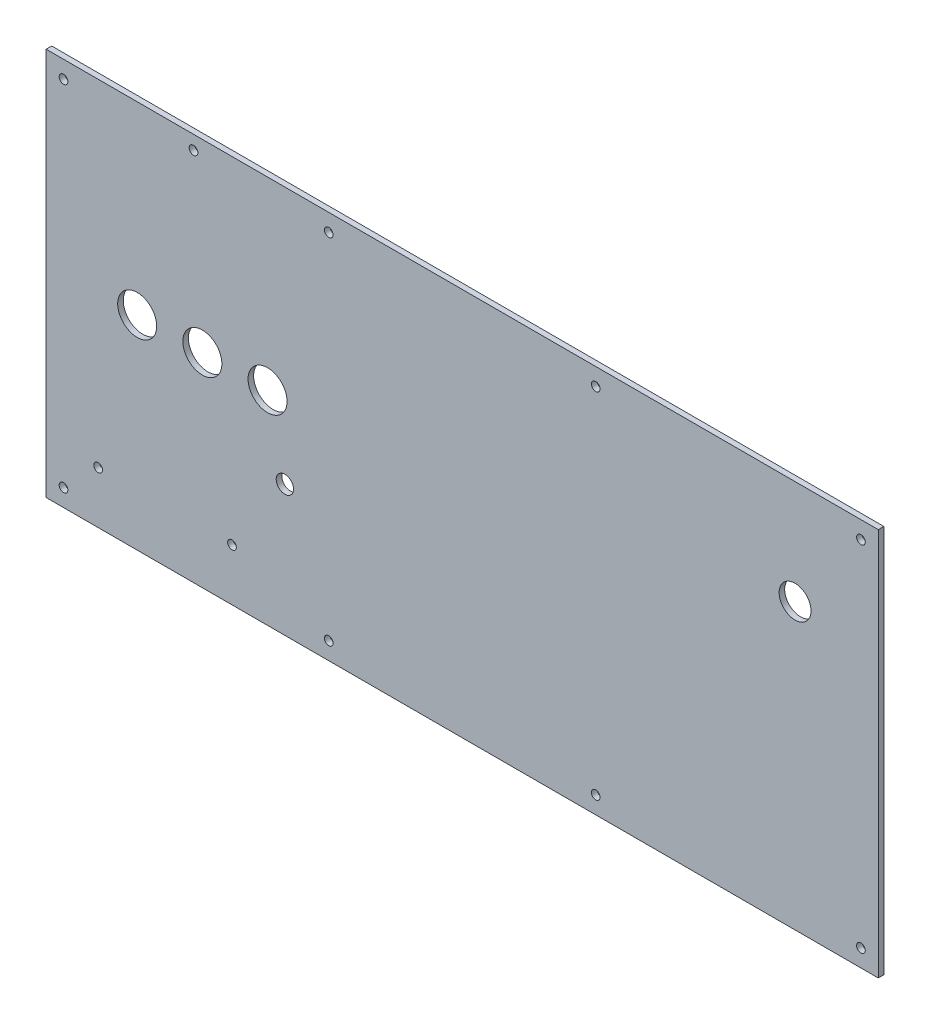
ISO-10303-21;
HEADER;
FILE_DESCRIPTION(('STEP AP214'),'2;1');
FILE_NAME('part.step','',(''),(''),'','','');
FILE_SCHEMA(('AUTOMOTIVE_DESIGN { 1 0 10303 214 1 1 1 1 }'));
ENDSEC;
DATA;
#1=APPLICATION_CONTEXT('core data for automotive mechanical design processes');
#2=APPLICATION_PROTOCOL_DEFINITION('international standard','automotive_design',2000,#1);
#3=PRODUCT_CONTEXT('',#1,'mechanical');
#4=PRODUCT('Part','Part','',(#3));
#5=PRODUCT_RELATED_PRODUCT_CATEGORY('part','',(#4));
#6=PRODUCT_DEFINITION_FORMATION('','',#4);
#7=PRODUCT_DEFINITION_CONTEXT('part definition',#1,'design');
#8=PRODUCT_DEFINITION('design','',#6,#7);
#9=PRODUCT_DEFINITION_SHAPE('','',#8);
#10=(LENGTH_UNIT() NAMED_UNIT(*) SI_UNIT(.MILLI.,.METRE.));
#11=(NAMED_UNIT(*) PLANE_ANGLE_UNIT() SI_UNIT($,.RADIAN.));
#12=(NAMED_UNIT(*) SI_UNIT($,.STERADIAN.) SOLID_ANGLE_UNIT());
#13=UNCERTAINTY_MEASURE_WITH_UNIT(LENGTH_MEASURE(1.E-05),#10,'distance_accuracy_value','');
#14=(GEOMETRIC_REPRESENTATION_CONTEXT(3) GLOBAL_UNCERTAINTY_ASSIGNED_CONTEXT((#13)) GLOBAL_UNIT_ASSIGNED_CONTEXT((#10,
#11,#12)) REPRESENTATION_CONTEXT('',''));
#15=CARTESIAN_POINT('',(0.,0.,0.));
#16=DIRECTION('',(0.,0.,1.));
#17=DIRECTION('',(1.,0.,0.));
#18=AXIS2_PLACEMENT_3D('',#15,#16,#17);
#19=CARTESIAN_POINT('',(-97.155,142.24,2.032));
#20=DIRECTION('',(1.,0.,0.));
#21=DIRECTION('',(0.,1.,0.));
#22=AXIS2_PLACEMENT_3D('',#19,#20,#21);
#23=PLANE('',#22);
#24=DIRECTION('',(0.,-1.,0.));
#25=VECTOR('',#24,1.);
#26=CARTESIAN_POINT('',(-97.155,142.24,0.));
#27=LINE('',#26,#25);
#28=CARTESIAN_POINT('',(-97.155,142.24,0.));
#29=VERTEX_POINT('',#28);
#30=CARTESIAN_POINT('',(-97.155,0.,0.));
#31=VERTEX_POINT('',#30);
#32=EDGE_CURVE('E94',#29,#31,#27,.T.);
#33=ORIENTED_EDGE('',*,*,#32,.T.);
#34=DIRECTION('',(0.,0.,-1.));
#35=VECTOR('',#34,1.);
#36=CARTESIAN_POINT('',(-97.155,0.,2.032));
#37=LINE('',#36,#35);
#38=CARTESIAN_POINT('',(-97.155,0.,2.032));
#39=VERTEX_POINT('',#38);
#40=EDGE_CURVE('E11',#39,#31,#37,.T.);
#41=ORIENTED_EDGE('',*,*,#40,.F.);
#42=DIRECTION('',(0.,-1.,0.));
#43=VECTOR('',#42,1.);
#44=CARTESIAN_POINT('',(-97.155,142.24,2.032));
#45=LINE('',#44,#43);
#46=CARTESIAN_POINT('',(-97.155,142.24,2.032));
#47=VERTEX_POINT('',#46);
#48=EDGE_CURVE('E82',#47,#39,#45,.T.);
#49=ORIENTED_EDGE('',*,*,#48,.F.);
#50=DIRECTION('',(0.,0.,-1.));
#51=VECTOR('',#50,1.);
#52=CARTESIAN_POINT('',(-97.155,142.24,2.032));
#53=LINE('',#52,#51);
#54=EDGE_CURVE('E90',#47,#29,#53,.T.);
#55=ORIENTED_EDGE('',*,*,#54,.T.);
#56=EDGE_LOOP('',(#33,#41,#49,#55));
#57=FACE_BOUND('',#56,.T.);
#58=ADVANCED_FACE('F31',(#57),#23,.F.);
#59=CARTESIAN_POINT('',(-97.155,0.,2.032));
#60=DIRECTION('',(0.,1.,0.));
#61=DIRECTION('',(0.,0.,1.));
#62=AXIS2_PLACEMENT_3D('',#59,#60,#61);
#63=PLANE('',#62);
#64=DIRECTION('',(1.,0.,0.));
#65=VECTOR('',#64,1.);
#66=CARTESIAN_POINT('',(-97.155,0.,0.));
#67=LINE('',#66,#65);
#68=CARTESIAN_POINT('',(207.645,0.,0.));
#69=VERTEX_POINT('',#68);
#70=EDGE_CURVE('E86',#31,#69,#67,.T.);
#71=ORIENTED_EDGE('',*,*,#70,.T.);
#72=DIRECTION('',(0.,0.,-1.));
#73=VECTOR('',#72,1.);
#74=CARTESIAN_POINT('',(207.645,0.,2.032));
#75=LINE('',#74,#73);
#76=CARTESIAN_POINT('',(207.645,0.,2.032));
#77=VERTEX_POINT('',#76);
#78=EDGE_CURVE('E39',#77,#69,#75,.T.);
#79=ORIENTED_EDGE('',*,*,#78,.F.);
#80=DIRECTION('',(1.,0.,0.));
#81=VECTOR('',#80,1.);
#82=CARTESIAN_POINT('',(-97.155,0.,2.032));
#83=LINE('',#82,#81);
#84=EDGE_CURVE('E77',#39,#77,#83,.T.);
#85=ORIENTED_EDGE('',*,*,#84,.F.);
#86=ORIENTED_EDGE('',*,*,#40,.T.);
#87=EDGE_LOOP('',(#71,#79,#85,#86));
#88=FACE_BOUND('',#87,.T.);
#89=ADVANCED_FACE('F85',(#88),#63,.F.);
#90=CARTESIAN_POINT('',(207.645,142.24,2.032));
#91=DIRECTION('',(-1.,0.,0.));
#92=DIRECTION('',(0.,-1.,0.));
#93=AXIS2_PLACEMENT_3D('',#90,#91,#92);
#94=PLANE('',#93);
#95=DIRECTION('',(0.,1.,0.));
#96=VECTOR('',#95,1.);
#97=CARTESIAN_POINT('',(207.645,142.24,0.));
#98=LINE('',#97,#96);
#99=CARTESIAN_POINT('',(207.645,142.24,0.));
#100=VERTEX_POINT('',#99);
#101=EDGE_CURVE('E64',#69,#100,#98,.T.);
#102=ORIENTED_EDGE('',*,*,#101,.T.);
#103=DIRECTION('',(0.,0.,-1.));
#104=VECTOR('',#103,1.);
#105=CARTESIAN_POINT('',(207.645,142.24,2.032));
#106=LINE('',#105,#104);
#107=CARTESIAN_POINT('',(207.645,142.24,2.032));
#108=VERTEX_POINT('',#107);
#109=EDGE_CURVE('E87',#108,#100,#106,.T.);
#110=ORIENTED_EDGE('',*,*,#109,.F.);
#111=DIRECTION('',(0.,1.,0.));
#112=VECTOR('',#111,1.);
#113=CARTESIAN_POINT('',(207.645,142.24,2.032));
#114=LINE('',#113,#112);
#115=EDGE_CURVE('E80',#77,#108,#114,.T.);
#116=ORIENTED_EDGE('',*,*,#115,.F.);
#117=ORIENTED_EDGE('',*,*,#78,.T.);
#118=EDGE_LOOP('',(#102,#110,#116,#117));
#119=FACE_BOUND('',#118,.T.);
#120=ADVANCED_FACE('F88',(#119),#94,.F.);
#121=CARTESIAN_POINT('',(-97.155,142.24,2.032));
#122=DIRECTION('',(0.,-1.,0.));
#123=DIRECTION('',(0.,0.,-1.));
#124=AXIS2_PLACEMENT_3D('',#121,#122,#123);
#125=PLANE('',#124);
#126=DIRECTION('',(-1.,0.,0.));
#127=VECTOR('',#126,1.);
#128=CARTESIAN_POINT('',(-97.155,142.24,0.));
#129=LINE('',#128,#127);
#130=EDGE_CURVE('E70',#100,#29,#129,.T.);
#131=ORIENTED_EDGE('',*,*,#130,.T.);
#132=ORIENTED_EDGE('',*,*,#54,.F.);
#133=DIRECTION('',(-1.,0.,0.));
#134=VECTOR('',#133,1.);
#135=CARTESIAN_POINT('',(-97.155,142.24,2.032));
#136=LINE('',#135,#134);
#137=EDGE_CURVE('E47',#108,#47,#136,.T.);
#138=ORIENTED_EDGE('',*,*,#137,.F.);
#139=ORIENTED_EDGE('',*,*,#109,.T.);
#140=EDGE_LOOP('',(#131,#132,#138,#139));
#141=FACE_BOUND('',#140,.T.);
#142=ADVANCED_FACE('F102',(#141),#125,.F.);
#143=CARTESIAN_POINT('',(-97.155,0.,2.032));
#144=DIRECTION('',(0.,0.,1.));
#145=DIRECTION('',(1.,0.,0.));
#146=AXIS2_PLACEMENT_3D('',#143,#144,#145);
#147=PLANE('',#146);
#148=CARTESIAN_POINT('',(177.165,104.14,2.032));
#149=DIRECTION('',(0.,0.,1.));
#150=DIRECTION('',(1.,0.,0.));
#151=AXIS2_PLACEMENT_3D('',#148,#149,#150);
#152=CIRCLE('',#151,5.84199999999999);
#153=CARTESIAN_POINT('',(183.007,104.14,2.032));
#154=VERTEX_POINT('',#153);
#155=EDGE_CURVE('E198',#154,#154,#152,.T.);
#156=ORIENTED_EDGE('',*,*,#155,.F.);
#157=EDGE_LOOP('',(#156));
#158=FACE_BOUND('',#157,.T.);
#159=CARTESIAN_POINT('',(-29.083,19.05,2.032));
#160=DIRECTION('',(0.,0.,1.));
#161=DIRECTION('',(1.,0.,0.));
#162=AXIS2_PLACEMENT_3D('',#159,#160,#161);
#163=CIRCLE('',#162,1.5875);
#164=CARTESIAN_POINT('',(-27.4955,19.05,2.032));
#165=VERTEX_POINT('',#164);
#166=EDGE_CURVE('E192',#165,#165,#163,.T.);
#167=ORIENTED_EDGE('',*,*,#166,.F.);
#168=EDGE_LOOP('',(#167));
#169=FACE_BOUND('',#168,.T.);
#170=CARTESIAN_POINT('',(-78.105,19.05,2.032));
#171=DIRECTION('',(0.,0.,1.));
#172=DIRECTION('',(1.,0.,0.));
#173=AXIS2_PLACEMENT_3D('',#170,#171,#172);
#174=CIRCLE('',#173,1.5875);
#175=CARTESIAN_POINT('',(-76.5175,19.05,2.032));
#176=VERTEX_POINT('',#175);
#177=EDGE_CURVE('E186',#176,#176,#174,.T.);
#178=ORIENTED_EDGE('',*,*,#177,.F.);
#179=EDGE_LOOP('',(#178));
#180=FACE_BOUND('',#179,.T.);
#181=CARTESIAN_POINT('',(-9.71550000000003,47.9425,2.032));
#182=DIRECTION('',(0.,0.,1.));
#183=DIRECTION('',(1.,0.,0.));
#184=AXIS2_PLACEMENT_3D('',#181,#182,#183);
#185=CIRCLE('',#184,3.175);
#186=CARTESIAN_POINT('',(-6.54050000000003,47.9425,2.032));
#187=VERTEX_POINT('',#186);
#188=EDGE_CURVE('E180',#187,#187,#185,.T.);
#189=ORIENTED_EDGE('',*,*,#188,.F.);
#190=EDGE_LOOP('',(#189));
#191=FACE_BOUND('',#190,.T.);
#192=CARTESIAN_POINT('',(-43.18,137.16,2.032));
#193=DIRECTION('',(0.,0.,1.));
#194=DIRECTION('',(1.,0.,0.));
#195=AXIS2_PLACEMENT_3D('',#192,#193,#194);
#196=CIRCLE('',#195,1.5875);
#197=CARTESIAN_POINT('',(-41.5925,137.16,2.032));
#198=VERTEX_POINT('',#197);
#199=EDGE_CURVE('E174',#198,#198,#196,.T.);
#200=ORIENTED_EDGE('',*,*,#199,.F.);
#201=EDGE_LOOP('',(#200));
#202=FACE_BOUND('',#201,.T.);
#203=CARTESIAN_POINT('',(-16.0655,74.6125,2.032));
#204=DIRECTION('',(0.,0.,1.));
#205=DIRECTION('',(1.,0.,0.));
#206=AXIS2_PLACEMENT_3D('',#203,#204,#205);
#207=CIRCLE('',#206,7.14375);
#208=CARTESIAN_POINT('',(-8.92175000000003,74.6125,2.032));
#209=VERTEX_POINT('',#208);
#210=EDGE_CURVE('E168',#209,#209,#207,.T.);
#211=ORIENTED_EDGE('',*,*,#210,.F.);
#212=EDGE_LOOP('',(#211));
#213=FACE_BOUND('',#212,.T.);
#214=CARTESIAN_POINT('',(-39.9415,74.6125,2.032));
#215=DIRECTION('',(0.,0.,1.));
#216=DIRECTION('',(1.,0.,0.));
#217=AXIS2_PLACEMENT_3D('',#214,#215,#216);
#218=CIRCLE('',#217,7.14374999999999);
#219=CARTESIAN_POINT('',(-32.79775,74.6125,2.032));
#220=VERTEX_POINT('',#219);
#221=EDGE_CURVE('E162',#220,#220,#218,.T.);
#222=ORIENTED_EDGE('',*,*,#221,.F.);
#223=EDGE_LOOP('',(#222));
#224=FACE_BOUND('',#223,.T.);
#225=CARTESIAN_POINT('',(-63.8175,74.6125,2.032));
#226=DIRECTION('',(0.,0.,1.));
#227=DIRECTION('',(1.,0.,0.));
#228=AXIS2_PLACEMENT_3D('',#225,#226,#227);
#229=CIRCLE('',#228,7.14374999999999);
#230=CARTESIAN_POINT('',(-56.67375,74.6125,2.032));
#231=VERTEX_POINT('',#230);
#232=EDGE_CURVE('E156',#231,#231,#229,.T.);
#233=ORIENTED_EDGE('',*,*,#232,.F.);
#234=EDGE_LOOP('',(#233));
#235=FACE_BOUND('',#234,.T.);
#236=CARTESIAN_POINT('',(201.295,135.89,2.032));
#237=DIRECTION('',(0.,0.,1.));
#238=DIRECTION('',(-1.,0.,0.));
#239=AXIS2_PLACEMENT_3D('',#236,#237,#238);
#240=CIRCLE('',#239,1.58750000000001);
#241=CARTESIAN_POINT('',(199.7075,135.89,2.032));
#242=VERTEX_POINT('',#241);
#243=EDGE_CURVE('E150',#242,#242,#240,.T.);
#244=ORIENTED_EDGE('',*,*,#243,.F.);
#245=EDGE_LOOP('',(#244));
#246=FACE_BOUND('',#245,.T.);
#247=CARTESIAN_POINT('',(201.295,6.35,2.032));
#248=DIRECTION('',(0.,0.,1.));
#249=DIRECTION('',(-1.,0.,0.));
#250=AXIS2_PLACEMENT_3D('',#247,#248,#249);
#251=CIRCLE('',#250,1.58750000000001);
#252=CARTESIAN_POINT('',(199.7075,6.35,2.032));
#253=VERTEX_POINT('',#252);
#254=EDGE_CURVE('E144',#253,#253,#251,.T.);
#255=ORIENTED_EDGE('',*,*,#254,.F.);
#256=EDGE_LOOP('',(#255));
#257=FACE_BOUND('',#256,.T.);
#258=CARTESIAN_POINT('',(104.14,135.89,2.032));
#259=DIRECTION('',(0.,0.,1.));
#260=DIRECTION('',(-1.,0.,0.));
#261=AXIS2_PLACEMENT_3D('',#258,#259,#260);
#262=CIRCLE('',#261,1.58749999999999);
#263=CARTESIAN_POINT('',(102.5525,135.89,2.032));
#264=VERTEX_POINT('',#263);
#265=EDGE_CURVE('E138',#264,#264,#262,.T.);
#266=ORIENTED_EDGE('',*,*,#265,.F.);
#267=EDGE_LOOP('',(#266));
#268=FACE_BOUND('',#267,.T.);
#269=CARTESIAN_POINT('',(104.14,6.34999999999882,2.032));
#270=DIRECTION('',(0.,0.,1.));
#271=DIRECTION('',(-1.,0.,0.));
#272=AXIS2_PLACEMENT_3D('',#269,#270,#271);
#273=CIRCLE('',#272,1.5875);
#274=CARTESIAN_POINT('',(102.5525,6.34999999999882,2.032));
#275=VERTEX_POINT('',#274);
#276=EDGE_CURVE('E132',#275,#275,#273,.T.);
#277=ORIENTED_EDGE('',*,*,#276,.F.);
#278=EDGE_LOOP('',(#277));
#279=FACE_BOUND('',#278,.T.);
#280=CARTESIAN_POINT('',(6.35,6.34999999999882,2.032));
#281=DIRECTION('',(0.,0.,1.));
#282=DIRECTION('',(1.,0.,0.));
#283=AXIS2_PLACEMENT_3D('',#280,#281,#282);
#284=CIRCLE('',#283,1.5875);
#285=CARTESIAN_POINT('',(7.9375,6.34999999999882,2.032));
#286=VERTEX_POINT('',#285);
#287=EDGE_CURVE('E126',#286,#286,#284,.T.);
#288=ORIENTED_EDGE('',*,*,#287,.F.);
#289=EDGE_LOOP('',(#288));
#290=FACE_BOUND('',#289,.T.);
#291=CARTESIAN_POINT('',(6.34999999999999,135.89,2.032));
#292=DIRECTION('',(0.,0.,1.));
#293=DIRECTION('',(1.,0.,0.));
#294=AXIS2_PLACEMENT_3D('',#291,#292,#293);
#295=CIRCLE('',#294,1.5875);
#296=CARTESIAN_POINT('',(7.93749999999999,135.89,2.032));
#297=VERTEX_POINT('',#296);
#298=EDGE_CURVE('E120',#297,#297,#295,.T.);
#299=ORIENTED_EDGE('',*,*,#298,.F.);
#300=EDGE_LOOP('',(#299));
#301=FACE_BOUND('',#300,.T.);
#302=CARTESIAN_POINT('',(-90.805,6.35,2.032));
#303=DIRECTION('',(0.,0.,1.));
#304=DIRECTION('',(1.,0.,0.));
#305=AXIS2_PLACEMENT_3D('',#302,#303,#304);
#306=CIRCLE('',#305,1.5875);
#307=CARTESIAN_POINT('',(-89.2175,6.35,2.032));
#308=VERTEX_POINT('',#307);
#309=EDGE_CURVE('E114',#308,#308,#306,.T.);
#310=ORIENTED_EDGE('',*,*,#309,.F.);
#311=EDGE_LOOP('',(#310));
#312=FACE_BOUND('',#311,.T.);
#313=CARTESIAN_POINT('',(-90.805,135.89,2.032));
#314=DIRECTION('',(0.,0.,1.));
#315=DIRECTION('',(1.,0.,0.));
#316=AXIS2_PLACEMENT_3D('',#313,#314,#315);
#317=CIRCLE('',#316,1.58749999999999);
#318=CARTESIAN_POINT('',(-89.2175000000001,135.89,2.032));
#319=VERTEX_POINT('',#318);
#320=EDGE_CURVE('E108',#319,#319,#317,.T.);
#321=ORIENTED_EDGE('',*,*,#320,.F.);
#322=EDGE_LOOP('',(#321));
#323=FACE_BOUND('',#322,.T.);
#324=ORIENTED_EDGE('',*,*,#48,.T.);
#325=ORIENTED_EDGE('',*,*,#84,.T.);
#326=ORIENTED_EDGE('',*,*,#115,.T.);
#327=ORIENTED_EDGE('',*,*,#137,.T.);
#328=EDGE_LOOP('',(#324,#325,#326,#327));
#329=FACE_BOUND('',#328,.T.);
#330=ADVANCED_FACE('F78',(#158,#169,#180,#191,#202,#213,#224,#235,#246,#257,#268,#279,#290,#301,
#312,#323,#329),#147,.T.);
#331=CARTESIAN_POINT('',(-97.155,0.,0.));
#332=DIRECTION('',(0.,0.,1.));
#333=DIRECTION('',(1.,0.,0.));
#334=AXIS2_PLACEMENT_3D('',#331,#332,#333);
#335=PLANE('',#334);
#336=CARTESIAN_POINT('',(177.165,104.14,0.));
#337=DIRECTION('',(0.,0.,1.));
#338=DIRECTION('',(1.,0.,0.));
#339=AXIS2_PLACEMENT_3D('',#336,#337,#338);
#340=CIRCLE('',#339,5.84199999999999);
#341=CARTESIAN_POINT('',(183.007,104.14,0.));
#342=VERTEX_POINT('',#341);
#343=EDGE_CURVE('E195',#342,#342,#340,.T.);
#344=ORIENTED_EDGE('',*,*,#343,.T.);
#345=EDGE_LOOP('',(#344));
#346=FACE_BOUND('',#345,.T.);
#347=CARTESIAN_POINT('',(-29.083,19.05,0.));
#348=DIRECTION('',(0.,0.,1.));
#349=DIRECTION('',(1.,0.,0.));
#350=AXIS2_PLACEMENT_3D('',#347,#348,#349);
#351=CIRCLE('',#350,1.5875);
#352=CARTESIAN_POINT('',(-27.4955,19.05,0.));
#353=VERTEX_POINT('',#352);
#354=EDGE_CURVE('E189',#353,#353,#351,.T.);
#355=ORIENTED_EDGE('',*,*,#354,.T.);
#356=EDGE_LOOP('',(#355));
#357=FACE_BOUND('',#356,.T.);
#358=CARTESIAN_POINT('',(-78.105,19.05,0.));
#359=DIRECTION('',(0.,0.,1.));
#360=DIRECTION('',(1.,0.,0.));
#361=AXIS2_PLACEMENT_3D('',#358,#359,#360);
#362=CIRCLE('',#361,1.5875);
#363=CARTESIAN_POINT('',(-76.5175,19.05,0.));
#364=VERTEX_POINT('',#363);
#365=EDGE_CURVE('E183',#364,#364,#362,.T.);
#366=ORIENTED_EDGE('',*,*,#365,.T.);
#367=EDGE_LOOP('',(#366));
#368=FACE_BOUND('',#367,.T.);
#369=CARTESIAN_POINT('',(-9.71550000000003,47.9425,0.));
#370=DIRECTION('',(0.,0.,1.));
#371=DIRECTION('',(1.,0.,0.));
#372=AXIS2_PLACEMENT_3D('',#369,#370,#371);
#373=CIRCLE('',#372,3.175);
#374=CARTESIAN_POINT('',(-6.54050000000003,47.9425,0.));
#375=VERTEX_POINT('',#374);
#376=EDGE_CURVE('E177',#375,#375,#373,.T.);
#377=ORIENTED_EDGE('',*,*,#376,.T.);
#378=EDGE_LOOP('',(#377));
#379=FACE_BOUND('',#378,.T.);
#380=CARTESIAN_POINT('',(-43.18,137.16,0.));
#381=DIRECTION('',(0.,0.,1.));
#382=DIRECTION('',(1.,0.,0.));
#383=AXIS2_PLACEMENT_3D('',#380,#381,#382);
#384=CIRCLE('',#383,1.5875);
#385=CARTESIAN_POINT('',(-41.5925,137.16,0.));
#386=VERTEX_POINT('',#385);
#387=EDGE_CURVE('E171',#386,#386,#384,.T.);
#388=ORIENTED_EDGE('',*,*,#387,.T.);
#389=EDGE_LOOP('',(#388));
#390=FACE_BOUND('',#389,.T.);
#391=CARTESIAN_POINT('',(-16.0655,74.6125,0.));
#392=DIRECTION('',(0.,0.,1.));
#393=DIRECTION('',(1.,0.,0.));
#394=AXIS2_PLACEMENT_3D('',#391,#392,#393);
#395=CIRCLE('',#394,7.14375);
#396=CARTESIAN_POINT('',(-8.92175000000003,74.6125,0.));
#397=VERTEX_POINT('',#396);
#398=EDGE_CURVE('E165',#397,#397,#395,.T.);
#399=ORIENTED_EDGE('',*,*,#398,.T.);
#400=EDGE_LOOP('',(#399));
#401=FACE_BOUND('',#400,.T.);
#402=CARTESIAN_POINT('',(-39.9415,74.6125,0.));
#403=DIRECTION('',(0.,0.,1.));
#404=DIRECTION('',(1.,0.,0.));
#405=AXIS2_PLACEMENT_3D('',#402,#403,#404);
#406=CIRCLE('',#405,7.14374999999999);
#407=CARTESIAN_POINT('',(-32.79775,74.6125,0.));
#408=VERTEX_POINT('',#407);
#409=EDGE_CURVE('E159',#408,#408,#406,.T.);
#410=ORIENTED_EDGE('',*,*,#409,.T.);
#411=EDGE_LOOP('',(#410));
#412=FACE_BOUND('',#411,.T.);
#413=CARTESIAN_POINT('',(-63.8175,74.6125,0.));
#414=DIRECTION('',(0.,0.,1.));
#415=DIRECTION('',(1.,0.,0.));
#416=AXIS2_PLACEMENT_3D('',#413,#414,#415);
#417=CIRCLE('',#416,7.14374999999999);
#418=CARTESIAN_POINT('',(-56.67375,74.6125,0.));
#419=VERTEX_POINT('',#418);
#420=EDGE_CURVE('E153',#419,#419,#417,.T.);
#421=ORIENTED_EDGE('',*,*,#420,.T.);
#422=EDGE_LOOP('',(#421));
#423=FACE_BOUND('',#422,.T.);
#424=CARTESIAN_POINT('',(201.295,135.89,0.));
#425=DIRECTION('',(0.,0.,1.));
#426=DIRECTION('',(-1.,0.,0.));
#427=AXIS2_PLACEMENT_3D('',#424,#425,#426);
#428=CIRCLE('',#427,1.58750000000001);
#429=CARTESIAN_POINT('',(199.7075,135.89,0.));
#430=VERTEX_POINT('',#429);
#431=EDGE_CURVE('E147',#430,#430,#428,.T.);
#432=ORIENTED_EDGE('',*,*,#431,.T.);
#433=EDGE_LOOP('',(#432));
#434=FACE_BOUND('',#433,.T.);
#435=CARTESIAN_POINT('',(201.295,6.35,0.));
#436=DIRECTION('',(0.,0.,1.));
#437=DIRECTION('',(-1.,0.,0.));
#438=AXIS2_PLACEMENT_3D('',#435,#436,#437);
#439=CIRCLE('',#438,1.58750000000001);
#440=CARTESIAN_POINT('',(199.7075,6.35,0.));
#441=VERTEX_POINT('',#440);
#442=EDGE_CURVE('E141',#441,#441,#439,.T.);
#443=ORIENTED_EDGE('',*,*,#442,.T.);
#444=EDGE_LOOP('',(#443));
#445=FACE_BOUND('',#444,.T.);
#446=CARTESIAN_POINT('',(104.14,135.89,0.));
#447=DIRECTION('',(0.,0.,1.));
#448=DIRECTION('',(-1.,0.,0.));
#449=AXIS2_PLACEMENT_3D('',#446,#447,#448);
#450=CIRCLE('',#449,1.58749999999999);
#451=CARTESIAN_POINT('',(102.5525,135.89,0.));
#452=VERTEX_POINT('',#451);
#453=EDGE_CURVE('E135',#452,#452,#450,.T.);
#454=ORIENTED_EDGE('',*,*,#453,.T.);
#455=EDGE_LOOP('',(#454));
#456=FACE_BOUND('',#455,.T.);
#457=CARTESIAN_POINT('',(104.14,6.34999999999882,0.));
#458=DIRECTION('',(0.,0.,1.));
#459=DIRECTION('',(-1.,0.,0.));
#460=AXIS2_PLACEMENT_3D('',#457,#458,#459);
#461=CIRCLE('',#460,1.5875);
#462=CARTESIAN_POINT('',(102.5525,6.34999999999882,0.));
#463=VERTEX_POINT('',#462);
#464=EDGE_CURVE('E129',#463,#463,#461,.T.);
#465=ORIENTED_EDGE('',*,*,#464,.T.);
#466=EDGE_LOOP('',(#465));
#467=FACE_BOUND('',#466,.T.);
#468=CARTESIAN_POINT('',(6.35,6.34999999999882,0.));
#469=DIRECTION('',(0.,0.,1.));
#470=DIRECTION('',(1.,0.,0.));
#471=AXIS2_PLACEMENT_3D('',#468,#469,#470);
#472=CIRCLE('',#471,1.5875);
#473=CARTESIAN_POINT('',(7.9375,6.34999999999882,0.));
#474=VERTEX_POINT('',#473);
#475=EDGE_CURVE('E123',#474,#474,#472,.T.);
#476=ORIENTED_EDGE('',*,*,#475,.T.);
#477=EDGE_LOOP('',(#476));
#478=FACE_BOUND('',#477,.T.);
#479=CARTESIAN_POINT('',(6.34999999999999,135.89,0.));
#480=DIRECTION('',(0.,0.,1.));
#481=DIRECTION('',(1.,0.,0.));
#482=AXIS2_PLACEMENT_3D('',#479,#480,#481);
#483=CIRCLE('',#482,1.5875);
#484=CARTESIAN_POINT('',(7.93749999999999,135.89,0.));
#485=VERTEX_POINT('',#484);
#486=EDGE_CURVE('E117',#485,#485,#483,.T.);
#487=ORIENTED_EDGE('',*,*,#486,.T.);
#488=EDGE_LOOP('',(#487));
#489=FACE_BOUND('',#488,.T.);
#490=CARTESIAN_POINT('',(-90.805,6.35,0.));
#491=DIRECTION('',(0.,0.,1.));
#492=DIRECTION('',(1.,0.,0.));
#493=AXIS2_PLACEMENT_3D('',#490,#491,#492);
#494=CIRCLE('',#493,1.5875);
#495=CARTESIAN_POINT('',(-89.2175,6.35,0.));
#496=VERTEX_POINT('',#495);
#497=EDGE_CURVE('E111',#496,#496,#494,.T.);
#498=ORIENTED_EDGE('',*,*,#497,.T.);
#499=EDGE_LOOP('',(#498));
#500=FACE_BOUND('',#499,.T.);
#501=CARTESIAN_POINT('',(-90.805,135.89,0.));
#502=DIRECTION('',(0.,0.,1.));
#503=DIRECTION('',(1.,0.,0.));
#504=AXIS2_PLACEMENT_3D('',#501,#502,#503);
#505=CIRCLE('',#504,1.58749999999999);
#506=CARTESIAN_POINT('',(-89.2175000000001,135.89,0.));
#507=VERTEX_POINT('',#506);
#508=EDGE_CURVE('E97',#507,#507,#505,.T.);
#509=ORIENTED_EDGE('',*,*,#508,.T.);
#510=EDGE_LOOP('',(#509));
#511=FACE_BOUND('',#510,.T.);
#512=ORIENTED_EDGE('',*,*,#32,.F.);
#513=ORIENTED_EDGE('',*,*,#130,.F.);
#514=ORIENTED_EDGE('',*,*,#101,.F.);
#515=ORIENTED_EDGE('',*,*,#70,.F.);
#516=EDGE_LOOP('',(#512,#513,#514,#515));
#517=FACE_BOUND('',#516,.T.);
#518=ADVANCED_FACE('F105',(#346,#357,#368,#379,#390,#401,#412,#423,#434,#445,#456,#467,#478,
#489,#500,#511,#517),#335,.F.);
#519=CARTESIAN_POINT('',(-90.805,135.89,0.));
#520=DIRECTION('',(0.,0.,1.));
#521=DIRECTION('',(1.,0.,0.));
#522=AXIS2_PLACEMENT_3D('',#519,#520,#521);
#523=CYLINDRICAL_SURFACE('',#522,1.58749999999999);
#524=ORIENTED_EDGE('',*,*,#508,.F.);
#525=EDGE_LOOP('',(#524));
#526=FACE_BOUND('',#525,.T.);
#527=ORIENTED_EDGE('',*,*,#320,.T.);
#528=EDGE_LOOP('',(#527));
#529=FACE_BOUND('',#528,.T.);
#530=ADVANCED_FACE('F246',(#526,#529),#523,.F.);
#531=CARTESIAN_POINT('',(-90.805,6.35,0.));
#532=DIRECTION('',(0.,0.,1.));
#533=DIRECTION('',(1.,0.,0.));
#534=AXIS2_PLACEMENT_3D('',#531,#532,#533);
#535=CYLINDRICAL_SURFACE('',#534,1.5875);
#536=ORIENTED_EDGE('',*,*,#497,.F.);
#537=EDGE_LOOP('',(#536));
#538=FACE_BOUND('',#537,.T.);
#539=ORIENTED_EDGE('',*,*,#309,.T.);
#540=EDGE_LOOP('',(#539));
#541=FACE_BOUND('',#540,.T.);
#542=ADVANCED_FACE('F248',(#538,#541),#535,.F.);
#543=CARTESIAN_POINT('',(6.34999999999999,135.89,0.));
#544=DIRECTION('',(0.,0.,1.));
#545=DIRECTION('',(1.,0.,0.));
#546=AXIS2_PLACEMENT_3D('',#543,#544,#545);
#547=CYLINDRICAL_SURFACE('',#546,1.5875);
#548=ORIENTED_EDGE('',*,*,#486,.F.);
#549=EDGE_LOOP('',(#548));
#550=FACE_BOUND('',#549,.T.);
#551=ORIENTED_EDGE('',*,*,#298,.T.);
#552=EDGE_LOOP('',(#551));
#553=FACE_BOUND('',#552,.T.);
#554=ADVANCED_FACE('F255',(#550,#553),#547,.F.);
#555=CARTESIAN_POINT('',(6.35,6.34999999999882,0.));
#556=DIRECTION('',(0.,0.,1.));
#557=DIRECTION('',(1.,0.,0.));
#558=AXIS2_PLACEMENT_3D('',#555,#556,#557);
#559=CYLINDRICAL_SURFACE('',#558,1.5875);
#560=ORIENTED_EDGE('',*,*,#475,.F.);
#561=EDGE_LOOP('',(#560));
#562=FACE_BOUND('',#561,.T.);
#563=ORIENTED_EDGE('',*,*,#287,.T.);
#564=EDGE_LOOP('',(#563));
#565=FACE_BOUND('',#564,.T.);
#566=ADVANCED_FACE('F382',(#562,#565),#559,.F.);
#567=CARTESIAN_POINT('',(104.14,6.34999999999882,0.));
#568=DIRECTION('',(0.,0.,1.));
#569=DIRECTION('',(1.,0.,0.));
#570=AXIS2_PLACEMENT_3D('',#567,#568,#569);
#571=CYLINDRICAL_SURFACE('',#570,1.5875);
#572=ORIENTED_EDGE('',*,*,#464,.F.);
#573=EDGE_LOOP('',(#572));
#574=FACE_BOUND('',#573,.T.);
#575=ORIENTED_EDGE('',*,*,#276,.T.);
#576=EDGE_LOOP('',(#575));
#577=FACE_BOUND('',#576,.T.);
#578=ADVANCED_FACE('F378',(#574,#577),#571,.F.);
#579=CARTESIAN_POINT('',(104.14,135.89,0.));
#580=DIRECTION('',(0.,0.,1.));
#581=DIRECTION('',(1.,0.,0.));
#582=AXIS2_PLACEMENT_3D('',#579,#580,#581);
#583=CYLINDRICAL_SURFACE('',#582,1.58749999999999);
#584=ORIENTED_EDGE('',*,*,#453,.F.);
#585=EDGE_LOOP('',(#584));
#586=FACE_BOUND('',#585,.T.);
#587=ORIENTED_EDGE('',*,*,#265,.T.);
#588=EDGE_LOOP('',(#587));
#589=FACE_BOUND('',#588,.T.);
#590=ADVANCED_FACE('F374',(#586,#589),#583,.F.);
#591=CARTESIAN_POINT('',(201.295,6.35,0.));
#592=DIRECTION('',(0.,0.,1.));
#593=DIRECTION('',(1.,0.,0.));
#594=AXIS2_PLACEMENT_3D('',#591,#592,#593);
#595=CYLINDRICAL_SURFACE('',#594,1.58750000000001);
#596=ORIENTED_EDGE('',*,*,#442,.F.);
#597=EDGE_LOOP('',(#596));
#598=FACE_BOUND('',#597,.T.);
#599=ORIENTED_EDGE('',*,*,#254,.T.);
#600=EDGE_LOOP('',(#599));
#601=FACE_BOUND('',#600,.T.);
#602=ADVANCED_FACE('F370',(#598,#601),#595,.F.);
#603=CARTESIAN_POINT('',(201.295,135.89,0.));
#604=DIRECTION('',(0.,0.,1.));
#605=DIRECTION('',(1.,0.,0.));
#606=AXIS2_PLACEMENT_3D('',#603,#604,#605);
#607=CYLINDRICAL_SURFACE('',#606,1.58750000000001);
#608=ORIENTED_EDGE('',*,*,#431,.F.);
#609=EDGE_LOOP('',(#608));
#610=FACE_BOUND('',#609,.T.);
#611=ORIENTED_EDGE('',*,*,#243,.T.);
#612=EDGE_LOOP('',(#611));
#613=FACE_BOUND('',#612,.T.);
#614=ADVANCED_FACE('F295',(#610,#613),#607,.F.);
#615=CARTESIAN_POINT('',(-63.8175,74.6125,0.));
#616=DIRECTION('',(0.,0.,1.));
#617=DIRECTION('',(1.,0.,0.));
#618=AXIS2_PLACEMENT_3D('',#615,#616,#617);
#619=CYLINDRICAL_SURFACE('',#618,7.14374999999999);
#620=ORIENTED_EDGE('',*,*,#420,.F.);
#621=EDGE_LOOP('',(#620));
#622=FACE_BOUND('',#621,.T.);
#623=ORIENTED_EDGE('',*,*,#232,.T.);
#624=EDGE_LOOP('',(#623));
#625=FACE_BOUND('',#624,.T.);
#626=ADVANCED_FACE('F289',(#622,#625),#619,.F.);
#627=CARTESIAN_POINT('',(-39.9415,74.6125,0.));
#628=DIRECTION('',(0.,0.,1.));
#629=DIRECTION('',(1.,0.,0.));
#630=AXIS2_PLACEMENT_3D('',#627,#628,#629);
#631=CYLINDRICAL_SURFACE('',#630,7.14374999999999);
#632=ORIENTED_EDGE('',*,*,#409,.F.);
#633=EDGE_LOOP('',(#632));
#634=FACE_BOUND('',#633,.T.);
#635=ORIENTED_EDGE('',*,*,#221,.T.);
#636=EDGE_LOOP('',(#635));
#637=FACE_BOUND('',#636,.T.);
#638=ADVANCED_FACE('F294',(#634,#637),#631,.F.);
#639=CARTESIAN_POINT('',(-16.0655,74.6125,0.));
#640=DIRECTION('',(0.,0.,1.));
#641=DIRECTION('',(1.,0.,0.));
#642=AXIS2_PLACEMENT_3D('',#639,#640,#641);
#643=CYLINDRICAL_SURFACE('',#642,7.14375);
#644=ORIENTED_EDGE('',*,*,#398,.F.);
#645=EDGE_LOOP('',(#644));
#646=FACE_BOUND('',#645,.T.);
#647=ORIENTED_EDGE('',*,*,#210,.T.);
#648=EDGE_LOOP('',(#647));
#649=FACE_BOUND('',#648,.T.);
#650=ADVANCED_FACE('F307',(#646,#649),#643,.F.);
#651=CARTESIAN_POINT('',(-43.18,137.16,0.));
#652=DIRECTION('',(0.,0.,1.));
#653=DIRECTION('',(1.,0.,0.));
#654=AXIS2_PLACEMENT_3D('',#651,#652,#653);
#655=CYLINDRICAL_SURFACE('',#654,1.5875);
#656=ORIENTED_EDGE('',*,*,#387,.F.);
#657=EDGE_LOOP('',(#656));
#658=FACE_BOUND('',#657,.T.);
#659=ORIENTED_EDGE('',*,*,#199,.T.);
#660=EDGE_LOOP('',(#659));
#661=FACE_BOUND('',#660,.T.);
#662=ADVANCED_FACE('F317',(#658,#661),#655,.F.);
#663=CARTESIAN_POINT('',(-9.71550000000003,47.9425,0.));
#664=DIRECTION('',(0.,0.,1.));
#665=DIRECTION('',(1.,0.,0.));
#666=AXIS2_PLACEMENT_3D('',#663,#664,#665);
#667=CYLINDRICAL_SURFACE('',#666,3.175);
#668=ORIENTED_EDGE('',*,*,#376,.F.);
#669=EDGE_LOOP('',(#668));
#670=FACE_BOUND('',#669,.T.);
#671=ORIENTED_EDGE('',*,*,#188,.T.);
#672=EDGE_LOOP('',(#671));
#673=FACE_BOUND('',#672,.T.);
#674=ADVANCED_FACE('F327',(#670,#673),#667,.F.);
#675=CARTESIAN_POINT('',(-78.105,19.05,0.));
#676=DIRECTION('',(0.,0.,1.));
#677=DIRECTION('',(1.,0.,0.));
#678=AXIS2_PLACEMENT_3D('',#675,#676,#677);
#679=CYLINDRICAL_SURFACE('',#678,1.5875);
#680=ORIENTED_EDGE('',*,*,#365,.F.);
#681=EDGE_LOOP('',(#680));
#682=FACE_BOUND('',#681,.T.);
#683=ORIENTED_EDGE('',*,*,#177,.T.);
#684=EDGE_LOOP('',(#683));
#685=FACE_BOUND('',#684,.T.);
#686=ADVANCED_FACE('F337',(#682,#685),#679,.F.);
#687=CARTESIAN_POINT('',(-29.083,19.05,0.));
#688=DIRECTION('',(0.,0.,1.));
#689=DIRECTION('',(1.,0.,0.));
#690=AXIS2_PLACEMENT_3D('',#687,#688,#689);
#691=CYLINDRICAL_SURFACE('',#690,1.5875);
#692=ORIENTED_EDGE('',*,*,#354,.F.);
#693=EDGE_LOOP('',(#692));
#694=FACE_BOUND('',#693,.T.);
#695=ORIENTED_EDGE('',*,*,#166,.T.);
#696=EDGE_LOOP('',(#695));
#697=FACE_BOUND('',#696,.T.);
#698=ADVANCED_FACE('F209',(#694,#697),#691,.F.);
#699=CARTESIAN_POINT('',(177.165,104.14,0.));
#700=DIRECTION('',(0.,0.,1.));
#701=DIRECTION('',(1.,0.,0.));
#702=AXIS2_PLACEMENT_3D('',#699,#700,#701);
#703=CYLINDRICAL_SURFACE('',#702,5.84199999999999);
#704=ORIENTED_EDGE('',*,*,#343,.F.);
#705=EDGE_LOOP('',(#704));
#706=FACE_BOUND('',#705,.T.);
#707=ORIENTED_EDGE('',*,*,#155,.T.);
#708=EDGE_LOOP('',(#707));
#709=FACE_BOUND('',#708,.T.);
#710=ADVANCED_FACE('F206',(#706,#709),#703,.F.);
#711=CLOSED_SHELL('',(#58,#89,#120,#142,#330,#518,#530,#542,#554,#566,#578,#590,#602,#614,#626,
#638,#650,#662,#674,#686,#698,#710));
#712=MANIFOLD_SOLID_BREP('B2',#711);
#713=ADVANCED_BREP_SHAPE_REPRESENTATION('',(#18,#712),#14);
#714=SHAPE_DEFINITION_REPRESENTATION(#9,#713);
ENDSEC;
END-ISO-10303-21;
